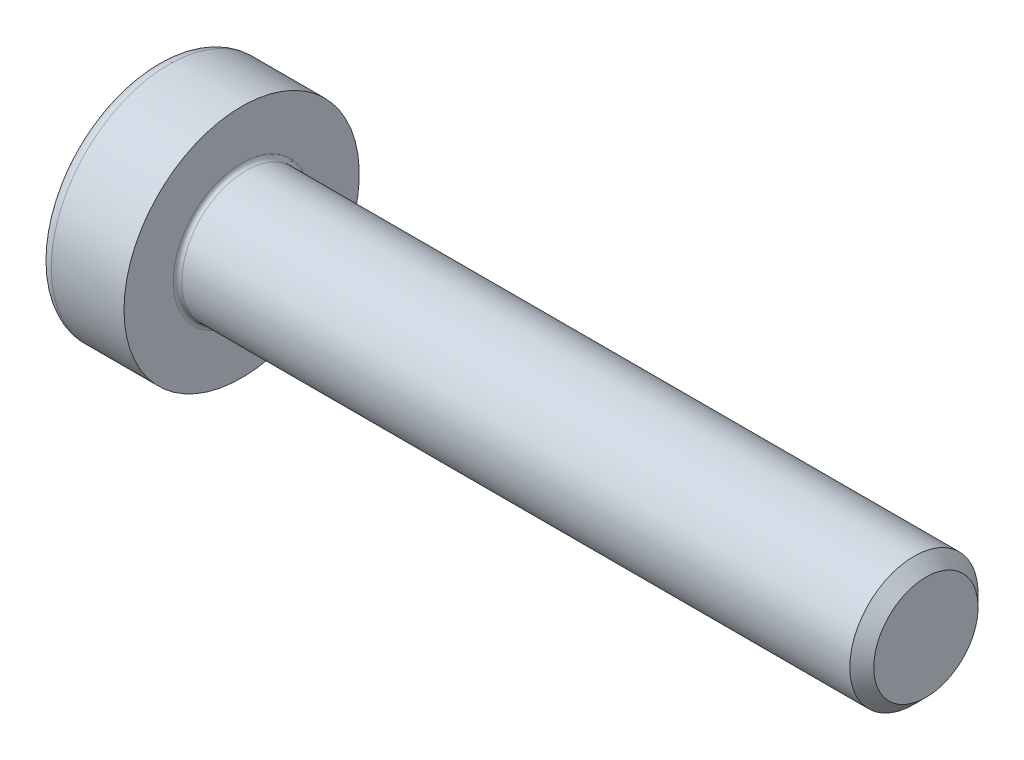
ISO-10303-21;
HEADER;
FILE_DESCRIPTION(('STEP AP214'),'2;1');
FILE_NAME('part.step','',(''),(''),'','','');
FILE_SCHEMA(('AUTOMOTIVE_DESIGN { 1 0 10303 214 1 1 1 1 }'));
ENDSEC;
DATA;
#1=APPLICATION_CONTEXT('core data for automotive mechanical design processes');
#2=APPLICATION_PROTOCOL_DEFINITION('international standard','automotive_design',2000,#1);
#3=PRODUCT_CONTEXT('',#1,'mechanical');
#4=PRODUCT('Part','Part','',(#3));
#5=PRODUCT_RELATED_PRODUCT_CATEGORY('part','',(#4));
#6=PRODUCT_DEFINITION_FORMATION('','',#4);
#7=PRODUCT_DEFINITION_CONTEXT('part definition',#1,'design');
#8=PRODUCT_DEFINITION('design','',#6,#7);
#9=PRODUCT_DEFINITION_SHAPE('','',#8);
#10=(LENGTH_UNIT() NAMED_UNIT(*) SI_UNIT(.MILLI.,.METRE.));
#11=(NAMED_UNIT(*) PLANE_ANGLE_UNIT() SI_UNIT($,.RADIAN.));
#12=(NAMED_UNIT(*) SI_UNIT($,.STERADIAN.) SOLID_ANGLE_UNIT());
#13=UNCERTAINTY_MEASURE_WITH_UNIT(LENGTH_MEASURE(1.E-05),#10,'distance_accuracy_value','');
#14=(GEOMETRIC_REPRESENTATION_CONTEXT(3) GLOBAL_UNCERTAINTY_ASSIGNED_CONTEXT((#13)) GLOBAL_UNIT_ASSIGNED_CONTEXT((#10,
#11,#12)) REPRESENTATION_CONTEXT('',''));
#15=CARTESIAN_POINT('',(0.,0.,0.));
#16=DIRECTION('',(0.,0.,1.));
#17=DIRECTION('',(1.,0.,0.));
#18=AXIS2_PLACEMENT_3D('',#15,#16,#17);
#19=CARTESIAN_POINT('',(0.,0.,0.));
#20=DIRECTION('',(-1.,0.,0.));
#21=DIRECTION('',(0.,0.,1.));
#22=AXIS2_PLACEMENT_3D('',#19,#20,#21);
#23=PLANE('',#22);
#24=DIRECTION('',(0.,-0.499999999999997,0.86602540378444));
#25=VECTOR('',#24,1.);
#26=CARTESIAN_POINT('',(0.,1.15470053837926,0.));
#27=LINE('',#26,#25);
#28=CARTESIAN_POINT('',(0.,1.15470053837926,0.));
#29=VERTEX_POINT('',#28);
#30=CARTESIAN_POINT('',(0.,0.577350269189635,0.999999999999995));
#31=VERTEX_POINT('',#30);
#32=EDGE_CURVE('E261',#29,#31,#27,.T.);
#33=ORIENTED_EDGE('',*,*,#32,.T.);
#34=DIRECTION('',(0.,1.,0.));
#35=VECTOR('',#34,1.);
#36=CARTESIAN_POINT('',(0.,-0.577350269189617,0.999999999999997));
#37=LINE('',#36,#35);
#38=CARTESIAN_POINT('',(0.,-0.577350269189617,0.999999999999997));
#39=VERTEX_POINT('',#38);
#40=EDGE_CURVE('E122',#39,#31,#37,.T.);
#41=ORIENTED_EDGE('',*,*,#40,.F.);
#42=DIRECTION('',(0.,-0.500000000000001,-0.866025403784438));
#43=VECTOR('',#42,1.);
#44=CARTESIAN_POINT('',(0.,-0.577350269189617,0.999999999999997));
#45=LINE('',#44,#43);
#46=CARTESIAN_POINT('',(0.,-1.15470053837924,0.));
#47=VERTEX_POINT('',#46);
#48=EDGE_CURVE('E264',#39,#47,#45,.T.);
#49=ORIENTED_EDGE('',*,*,#48,.T.);
#50=DIRECTION('',(0.,0.499999999999998,-0.86602540378444));
#51=VECTOR('',#50,1.);
#52=CARTESIAN_POINT('',(0.,-1.15470053837924,0.));
#53=LINE('',#52,#51);
#54=CARTESIAN_POINT('',(0.,-0.577350269189621,-1.));
#55=VERTEX_POINT('',#54);
#56=EDGE_CURVE('E267',#47,#55,#53,.T.);
#57=ORIENTED_EDGE('',*,*,#56,.T.);
#58=DIRECTION('',(0.,-1.,0.));
#59=VECTOR('',#58,1.);
#60=CARTESIAN_POINT('',(0.,0.57735026918963,-1.00000000000001));
#61=LINE('',#60,#59);
#62=CARTESIAN_POINT('',(0.,0.57735026918963,-1.00000000000001));
#63=VERTEX_POINT('',#62);
#64=EDGE_CURVE('E270',#63,#55,#61,.T.);
#65=ORIENTED_EDGE('',*,*,#64,.F.);
#66=DIRECTION('',(0.,-0.500000000000001,-0.866025403784438));
#67=VECTOR('',#66,1.);
#68=CARTESIAN_POINT('',(0.,1.15470053837926,0.));
#69=LINE('',#68,#67);
#70=EDGE_CURVE('E117',#29,#63,#69,.T.);
#71=ORIENTED_EDGE('',*,*,#70,.F.);
#72=EDGE_LOOP('',(#33,#41,#49,#57,#65,#71));
#73=FACE_BOUND('',#72,.T.);
#74=CARTESIAN_POINT('',(0.,0.,0.));
#75=DIRECTION('',(-1.,0.,0.));
#76=DIRECTION('',(0.,0.,1.));
#77=AXIS2_PLACEMENT_3D('',#74,#75,#76);
#78=CIRCLE('',#77,2.45);
#79=CARTESIAN_POINT('',(0.,0.,2.45));
#80=VERTEX_POINT('',#79);
#81=EDGE_CURVE('E38',#80,#80,#78,.T.);
#82=ORIENTED_EDGE('',*,*,#81,.T.);
#83=EDGE_LOOP('',(#82));
#84=FACE_BOUND('',#83,.T.);
#85=ADVANCED_FACE('F30',(#73,#84),#23,.T.);
#86=CARTESIAN_POINT('',(-31.75,0.,0.));
#87=DIRECTION('',(-1.,0.,0.));
#88=DIRECTION('',(0.,0.,1.));
#89=AXIS2_PLACEMENT_3D('',#86,#87,#88);
#90=CYLINDRICAL_SURFACE('',#89,2.75);
#91=CARTESIAN_POINT('',(0.300000000000002,0.,0.));
#92=DIRECTION('',(-1.,0.,0.));
#93=DIRECTION('',(0.,0.,1.));
#94=AXIS2_PLACEMENT_3D('',#91,#92,#93);
#95=CIRCLE('',#94,2.75);
#96=CARTESIAN_POINT('',(0.300000000000002,0.,2.75));
#97=VERTEX_POINT('',#96);
#98=EDGE_CURVE('E11',#97,#97,#95,.F.);
#99=ORIENTED_EDGE('',*,*,#98,.T.);
#100=EDGE_LOOP('',(#99));
#101=FACE_BOUND('',#100,.T.);
#102=CARTESIAN_POINT('',(2.,0.,0.));
#103=DIRECTION('',(-1.,0.,0.));
#104=DIRECTION('',(0.,0.,1.));
#105=AXIS2_PLACEMENT_3D('',#102,#103,#104);
#106=CIRCLE('',#105,2.75);
#107=CARTESIAN_POINT('',(2.,0.,2.75));
#108=VERTEX_POINT('',#107);
#109=EDGE_CURVE('E140',#108,#108,#106,.T.);
#110=ORIENTED_EDGE('',*,*,#109,.T.);
#111=EDGE_LOOP('',(#110));
#112=FACE_BOUND('',#111,.T.);
#113=ADVANCED_FACE('F164',(#101,#112),#90,.T.);
#114=CARTESIAN_POINT('',(2.,2.75,0.));
#115=DIRECTION('',(1.,0.,0.));
#116=DIRECTION('',(0.,0.,-1.));
#117=AXIS2_PLACEMENT_3D('',#114,#115,#116);
#118=PLANE('',#117);
#119=CARTESIAN_POINT('',(2.,0.,0.));
#120=DIRECTION('',(1.,0.,0.));
#121=DIRECTION('',(0.,0.,-1.));
#122=AXIS2_PLACEMENT_3D('',#119,#120,#121);
#123=CIRCLE('',#122,1.59999999999999);
#124=CARTESIAN_POINT('',(2.,0.,-1.59999999999999));
#125=VERTEX_POINT('',#124);
#126=EDGE_CURVE('E143',#125,#125,#123,.F.);
#127=ORIENTED_EDGE('',*,*,#126,.T.);
#128=EDGE_LOOP('',(#127));
#129=FACE_BOUND('',#128,.T.);
#130=ORIENTED_EDGE('',*,*,#109,.F.);
#131=EDGE_LOOP('',(#130));
#132=FACE_BOUND('',#131,.T.);
#133=ADVANCED_FACE('F170',(#129,#132),#118,.T.);
#134=CARTESIAN_POINT('',(-31.75,0.,0.));
#135=DIRECTION('',(-1.,0.,0.));
#136=DIRECTION('',(0.,0.,1.));
#137=AXIS2_PLACEMENT_3D('',#134,#135,#136);
#138=CYLINDRICAL_SURFACE('',#137,1.49999999999999);
#139=CARTESIAN_POINT('',(2.1,0.,0.));
#140=DIRECTION('',(1.,0.,0.));
#141=DIRECTION('',(0.,0.,-1.));
#142=AXIS2_PLACEMENT_3D('',#139,#140,#141);
#143=CIRCLE('',#142,1.49999999999999);
#144=CARTESIAN_POINT('',(2.1,0.,-1.49999999999999));
#145=VERTEX_POINT('',#144);
#146=EDGE_CURVE('E146',#145,#145,#143,.T.);
#147=ORIENTED_EDGE('',*,*,#146,.T.);
#148=EDGE_LOOP('',(#147));
#149=FACE_BOUND('',#148,.T.);
#150=CARTESIAN_POINT('',(17.7195,0.,0.));
#151=DIRECTION('',(-1.,0.,0.));
#152=DIRECTION('',(0.,0.,1.));
#153=AXIS2_PLACEMENT_3D('',#150,#151,#152);
#154=CIRCLE('',#153,1.49999999999999);
#155=CARTESIAN_POINT('',(17.7195,0.,1.49999999999999));
#156=VERTEX_POINT('',#155);
#157=EDGE_CURVE('E137',#156,#156,#154,.T.);
#158=ORIENTED_EDGE('',*,*,#157,.T.);
#159=EDGE_LOOP('',(#158));
#160=FACE_BOUND('',#159,.T.);
#161=ADVANCED_FACE('F176',(#149,#160),#138,.T.);
#162=CARTESIAN_POINT('',(18.,0.,0.));
#163=DIRECTION('',(-1.,0.,0.));
#164=DIRECTION('',(0.,0.,1.));
#165=AXIS2_PLACEMENT_3D('',#162,#163,#164);
#166=CONICAL_SURFACE('',#165,1.2195,0.785398163397407);
#167=ORIENTED_EDGE('',*,*,#157,.F.);
#168=EDGE_LOOP('',(#167));
#169=FACE_BOUND('',#168,.T.);
#170=CARTESIAN_POINT('',(18.,0.,0.));
#171=DIRECTION('',(-1.,0.,0.));
#172=DIRECTION('',(0.,0.,1.));
#173=AXIS2_PLACEMENT_3D('',#170,#171,#172);
#174=CIRCLE('',#173,1.2195);
#175=CARTESIAN_POINT('',(18.,0.,1.2195));
#176=VERTEX_POINT('',#175);
#177=EDGE_CURVE('E133',#176,#176,#174,.T.);
#178=ORIENTED_EDGE('',*,*,#177,.T.);
#179=EDGE_LOOP('',(#178));
#180=FACE_BOUND('',#179,.T.);
#181=ADVANCED_FACE('F180',(#169,#180),#166,.T.);
#182=CARTESIAN_POINT('',(18.,1.2195,0.));
#183=DIRECTION('',(1.,0.,0.));
#184=DIRECTION('',(0.,0.,-1.));
#185=AXIS2_PLACEMENT_3D('',#182,#183,#184);
#186=PLANE('',#185);
#187=ORIENTED_EDGE('',*,*,#177,.F.);
#188=EDGE_LOOP('',(#187));
#189=FACE_BOUND('',#188,.T.);
#190=ADVANCED_FACE('F160',(#189),#186,.T.);
#191=CARTESIAN_POINT('',(2.1,0.,0.));
#192=DIRECTION('',(1.,0.,0.));
#193=DIRECTION('',(0.,0.,-1.));
#194=AXIS2_PLACEMENT_3D('',#191,#192,#193);
#195=TOROIDAL_SURFACE('',#194,1.59999999999999,0.1);
#196=ORIENTED_EDGE('',*,*,#146,.F.);
#197=EDGE_LOOP('',(#196));
#198=FACE_BOUND('',#197,.T.);
#199=ORIENTED_EDGE('',*,*,#126,.F.);
#200=EDGE_LOOP('',(#199));
#201=FACE_BOUND('',#200,.T.);
#202=ADVANCED_FACE('F153',(#198,#201),#195,.F.);
#203=CARTESIAN_POINT('',(0.300000000000002,0.,0.));
#204=DIRECTION('',(-1.,0.,0.));
#205=DIRECTION('',(0.,0.,1.));
#206=AXIS2_PLACEMENT_3D('',#203,#204,#205);
#207=TOROIDAL_SURFACE('',#206,2.45,0.3);
#208=ORIENTED_EDGE('',*,*,#98,.F.);
#209=EDGE_LOOP('',(#208));
#210=FACE_BOUND('',#209,.T.);
#211=ORIENTED_EDGE('',*,*,#81,.F.);
#212=EDGE_LOOP('',(#211));
#213=FACE_BOUND('',#212,.T.);
#214=ADVANCED_FACE('F32',(#210,#213),#207,.T.);
#215=CARTESIAN_POINT('',(1.5,1.15470053837926,0.));
#216=DIRECTION('',(0.,-0.86602540378444,-0.499999999999997));
#217=DIRECTION('',(0.,0.499999999999998,-0.86602540378444));
#218=AXIS2_PLACEMENT_3D('',#215,#216,#217);
#219=PLANE('',#218);
#220=ORIENTED_EDGE('',*,*,#32,.F.);
#221=DIRECTION('',(-1.,0.,0.));
#222=VECTOR('',#221,1.);
#223=CARTESIAN_POINT('',(1.5,1.15470053837926,0.));
#224=LINE('',#223,#222);
#225=CARTESIAN_POINT('',(1.5,1.15470053837926,0.));
#226=VERTEX_POINT('',#225);
#227=EDGE_CURVE('E260',#226,#29,#224,.T.);
#228=ORIENTED_EDGE('',*,*,#227,.F.);
#229=DIRECTION('',(0.,-0.499999999999997,0.86602540378444));
#230=VECTOR('',#229,1.);
#231=CARTESIAN_POINT('',(1.5,1.15470053837926,0.));
#232=LINE('',#231,#230);
#233=CARTESIAN_POINT('',(1.5,0.86602540378444,0.499999999999997));
#234=VERTEX_POINT('',#233);
#235=EDGE_CURVE('E45',#226,#234,#232,.T.);
#236=ORIENTED_EDGE('',*,*,#235,.T.);
#237=CARTESIAN_POINT('',(1.5,0.577350269189635,0.999999999999995));
#238=VERTEX_POINT('',#237);
#239=EDGE_CURVE('E103',#234,#238,#232,.T.);
#240=ORIENTED_EDGE('',*,*,#239,.T.);
#241=DIRECTION('',(-1.,0.,0.));
#242=VECTOR('',#241,1.);
#243=CARTESIAN_POINT('',(1.5,0.577350269189635,0.999999999999995));
#244=LINE('',#243,#242);
#245=EDGE_CURVE('E115',#238,#31,#244,.T.);
#246=ORIENTED_EDGE('',*,*,#245,.T.);
#247=EDGE_LOOP('',(#220,#228,#236,#240,#246));
#248=FACE_BOUND('',#247,.T.);
#249=ADVANCED_FACE('F114',(#248),#219,.T.);
#250=CARTESIAN_POINT('',(1.5,-0.577350269189617,0.999999999999997));
#251=DIRECTION('',(0.,0.,1.));
#252=DIRECTION('',(0.,-1.,0.));
#253=AXIS2_PLACEMENT_3D('',#250,#251,#252);
#254=PLANE('',#253);
#255=ORIENTED_EDGE('',*,*,#40,.T.);
#256=ORIENTED_EDGE('',*,*,#245,.F.);
#257=DIRECTION('',(0.,1.,0.));
#258=VECTOR('',#257,1.);
#259=CARTESIAN_POINT('',(1.5,-0.577350269189617,0.999999999999997));
#260=LINE('',#259,#258);
#261=CARTESIAN_POINT('',(1.5,0.,0.999999999999996));
#262=VERTEX_POINT('',#261);
#263=EDGE_CURVE('E101',#262,#238,#260,.T.);
#264=ORIENTED_EDGE('',*,*,#263,.F.);
#265=CARTESIAN_POINT('',(1.5,-0.577350269189617,0.999999999999997));
#266=VERTEX_POINT('',#265);
#267=EDGE_CURVE('E111',#266,#262,#260,.T.);
#268=ORIENTED_EDGE('',*,*,#267,.F.);
#269=DIRECTION('',(-1.,0.,0.));
#270=VECTOR('',#269,1.);
#271=CARTESIAN_POINT('',(1.5,-0.577350269189617,0.999999999999997));
#272=LINE('',#271,#270);
#273=EDGE_CURVE('E124',#266,#39,#272,.T.);
#274=ORIENTED_EDGE('',*,*,#273,.T.);
#275=EDGE_LOOP('',(#255,#256,#264,#268,#274));
#276=FACE_BOUND('',#275,.T.);
#277=ADVANCED_FACE('F119',(#276),#254,.F.);
#278=CARTESIAN_POINT('',(1.5,-0.577350269189617,0.999999999999997));
#279=DIRECTION('',(0.,0.866025403784438,-0.500000000000001));
#280=DIRECTION('',(0.,0.500000000000001,0.866025403784438));
#281=AXIS2_PLACEMENT_3D('',#278,#279,#280);
#282=PLANE('',#281);
#283=ORIENTED_EDGE('',*,*,#48,.F.);
#284=ORIENTED_EDGE('',*,*,#273,.F.);
#285=DIRECTION('',(0.,-0.500000000000001,-0.866025403784438));
#286=VECTOR('',#285,1.);
#287=CARTESIAN_POINT('',(1.5,-0.577350269189617,0.999999999999997));
#288=LINE('',#287,#286);
#289=CARTESIAN_POINT('',(1.5,-0.86602540378443,0.499999999999996));
#290=VERTEX_POINT('',#289);
#291=EDGE_CURVE('E241',#266,#290,#288,.T.);
#292=ORIENTED_EDGE('',*,*,#291,.T.);
#293=CARTESIAN_POINT('',(1.5,-1.15470053837924,0.));
#294=VERTEX_POINT('',#293);
#295=EDGE_CURVE('E243',#290,#294,#288,.T.);
#296=ORIENTED_EDGE('',*,*,#295,.T.);
#297=DIRECTION('',(-1.,0.,0.));
#298=VECTOR('',#297,1.);
#299=CARTESIAN_POINT('',(1.5,-1.15470053837924,0.));
#300=LINE('',#299,#298);
#301=EDGE_CURVE('E129',#294,#47,#300,.T.);
#302=ORIENTED_EDGE('',*,*,#301,.T.);
#303=EDGE_LOOP('',(#283,#284,#292,#296,#302));
#304=FACE_BOUND('',#303,.T.);
#305=ADVANCED_FACE('F193',(#304),#282,.T.);
#306=CARTESIAN_POINT('',(1.5,-1.15470053837924,0.));
#307=DIRECTION('',(0.,0.86602540378444,0.499999999999998));
#308=DIRECTION('',(0.,-0.499999999999998,0.86602540378444));
#309=AXIS2_PLACEMENT_3D('',#306,#307,#308);
#310=PLANE('',#309);
#311=ORIENTED_EDGE('',*,*,#56,.F.);
#312=ORIENTED_EDGE('',*,*,#301,.F.);
#313=DIRECTION('',(0.,0.499999999999998,-0.86602540378444));
#314=VECTOR('',#313,1.);
#315=CARTESIAN_POINT('',(1.5,-1.15470053837924,0.));
#316=LINE('',#315,#314);
#317=CARTESIAN_POINT('',(1.5,-0.866025403784436,-0.499999999999996));
#318=VERTEX_POINT('',#317);
#319=EDGE_CURVE('E246',#294,#318,#316,.T.);
#320=ORIENTED_EDGE('',*,*,#319,.T.);
#321=CARTESIAN_POINT('',(1.5,-0.577350269189621,-1.));
#322=VERTEX_POINT('',#321);
#323=EDGE_CURVE('E250',#318,#322,#316,.T.);
#324=ORIENTED_EDGE('',*,*,#323,.T.);
#325=DIRECTION('',(-1.,0.,0.));
#326=VECTOR('',#325,1.);
#327=CARTESIAN_POINT('',(1.5,-0.577350269189621,-1.));
#328=LINE('',#327,#326);
#329=EDGE_CURVE('E279',#322,#55,#328,.T.);
#330=ORIENTED_EDGE('',*,*,#329,.T.);
#331=EDGE_LOOP('',(#311,#312,#320,#324,#330));
#332=FACE_BOUND('',#331,.T.);
#333=ADVANCED_FACE('F196',(#332),#310,.T.);
#334=CARTESIAN_POINT('',(1.5,0.57735026918963,-1.00000000000001));
#335=DIRECTION('',(0.,0.,-1.));
#336=DIRECTION('',(0.,1.,0.));
#337=AXIS2_PLACEMENT_3D('',#334,#335,#336);
#338=PLANE('',#337);
#339=ORIENTED_EDGE('',*,*,#64,.T.);
#340=ORIENTED_EDGE('',*,*,#329,.F.);
#341=DIRECTION('',(0.,-1.,0.));
#342=VECTOR('',#341,1.);
#343=CARTESIAN_POINT('',(1.5,0.57735026918963,-1.00000000000001));
#344=LINE('',#343,#342);
#345=CARTESIAN_POINT('',(1.5,0.,-1.));
#346=VERTEX_POINT('',#345);
#347=EDGE_CURVE('E254',#346,#322,#344,.T.);
#348=ORIENTED_EDGE('',*,*,#347,.F.);
#349=CARTESIAN_POINT('',(1.5,0.57735026918963,-1.00000000000001));
#350=VERTEX_POINT('',#349);
#351=EDGE_CURVE('E255',#350,#346,#344,.T.);
#352=ORIENTED_EDGE('',*,*,#351,.F.);
#353=DIRECTION('',(-1.,0.,0.));
#354=VECTOR('',#353,1.);
#355=CARTESIAN_POINT('',(1.5,0.57735026918963,-1.00000000000001));
#356=LINE('',#355,#354);
#357=EDGE_CURVE('E276',#350,#63,#356,.T.);
#358=ORIENTED_EDGE('',*,*,#357,.T.);
#359=EDGE_LOOP('',(#339,#340,#348,#352,#358));
#360=FACE_BOUND('',#359,.T.);
#361=ADVANCED_FACE('F200',(#360),#338,.F.);
#362=CARTESIAN_POINT('',(1.5,1.15470053837926,0.));
#363=DIRECTION('',(0.,0.866025403784438,-0.500000000000001));
#364=DIRECTION('',(0.,0.500000000000001,0.866025403784438));
#365=AXIS2_PLACEMENT_3D('',#362,#363,#364);
#366=PLANE('',#365);
#367=ORIENTED_EDGE('',*,*,#70,.T.);
#368=ORIENTED_EDGE('',*,*,#357,.F.);
#369=DIRECTION('',(0.,-0.500000000000001,-0.866025403784438));
#370=VECTOR('',#369,1.);
#371=CARTESIAN_POINT('',(1.5,1.15470053837926,0.));
#372=LINE('',#371,#370);
#373=CARTESIAN_POINT('',(1.5,0.866025403784444,-0.500000000000005));
#374=VERTEX_POINT('',#373);
#375=EDGE_CURVE('E258',#374,#350,#372,.T.);
#376=ORIENTED_EDGE('',*,*,#375,.F.);
#377=EDGE_CURVE('E232',#226,#374,#372,.T.);
#378=ORIENTED_EDGE('',*,*,#377,.F.);
#379=ORIENTED_EDGE('',*,*,#227,.T.);
#380=EDGE_LOOP('',(#367,#368,#376,#378,#379));
#381=FACE_BOUND('',#380,.T.);
#382=ADVANCED_FACE('F204',(#381),#366,.F.);
#383=CARTESIAN_POINT('',(1.5,0.577350269189635,0.999999999999995));
#384=DIRECTION('',(-1.,0.,0.));
#385=DIRECTION('',(0.,0.,1.));
#386=AXIS2_PLACEMENT_3D('',#383,#384,#385);
#387=PLANE('',#386);
#388=CARTESIAN_POINT('',(1.5,0.,0.));
#389=DIRECTION('',(-1.,0.,0.));
#390=DIRECTION('',(0.,0.,1.));
#391=AXIS2_PLACEMENT_3D('',#388,#389,#390);
#392=CIRCLE('',#391,1.);
#393=EDGE_CURVE('E123',#290,#262,#392,.T.);
#394=ORIENTED_EDGE('',*,*,#393,.F.);
#395=ORIENTED_EDGE('',*,*,#291,.F.);
#396=ORIENTED_EDGE('',*,*,#267,.T.);
#397=EDGE_LOOP('',(#394,#395,#396));
#398=FACE_BOUND('',#397,.T.);
#399=ADVANCED_FACE('F208',(#398),#387,.T.);
#400=EDGE_CURVE('E127',#318,#290,#392,.T.);
#401=ORIENTED_EDGE('',*,*,#400,.F.);
#402=ORIENTED_EDGE('',*,*,#319,.F.);
#403=ORIENTED_EDGE('',*,*,#295,.F.);
#404=EDGE_LOOP('',(#401,#402,#403));
#405=FACE_BOUND('',#404,.T.);
#406=ADVANCED_FACE('F211',(#405),#387,.T.);
#407=EDGE_CURVE('E285',#346,#318,#392,.T.);
#408=ORIENTED_EDGE('',*,*,#407,.F.);
#409=ORIENTED_EDGE('',*,*,#347,.T.);
#410=ORIENTED_EDGE('',*,*,#323,.F.);
#411=EDGE_LOOP('',(#408,#409,#410));
#412=FACE_BOUND('',#411,.T.);
#413=ADVANCED_FACE('F216',(#412),#387,.T.);
#414=EDGE_CURVE('E235',#374,#346,#392,.T.);
#415=ORIENTED_EDGE('',*,*,#414,.F.);
#416=ORIENTED_EDGE('',*,*,#375,.T.);
#417=ORIENTED_EDGE('',*,*,#351,.T.);
#418=EDGE_LOOP('',(#415,#416,#417));
#419=FACE_BOUND('',#418,.T.);
#420=ADVANCED_FACE('F223',(#419),#387,.T.);
#421=EDGE_CURVE('E134',#234,#374,#392,.T.);
#422=ORIENTED_EDGE('',*,*,#421,.F.);
#423=ORIENTED_EDGE('',*,*,#235,.F.);
#424=ORIENTED_EDGE('',*,*,#377,.T.);
#425=EDGE_LOOP('',(#422,#423,#424));
#426=FACE_BOUND('',#425,.T.);
#427=ADVANCED_FACE('F219',(#426),#387,.T.);
#428=EDGE_CURVE('E106',#262,#234,#392,.T.);
#429=ORIENTED_EDGE('',*,*,#428,.F.);
#430=ORIENTED_EDGE('',*,*,#263,.T.);
#431=ORIENTED_EDGE('',*,*,#239,.F.);
#432=EDGE_LOOP('',(#429,#430,#431));
#433=FACE_BOUND('',#432,.T.);
#434=ADVANCED_FACE('F102',(#433),#387,.T.);
#435=CARTESIAN_POINT('',(1.5,0.,0.));
#436=DIRECTION('',(-1.,0.,0.));
#437=DIRECTION('',(0.,0.,1.));
#438=AXIS2_PLACEMENT_3D('',#435,#436,#437);
#439=CONICAL_SURFACE('',#438,1.,1.04719755119659);
#440=CARTESIAN_POINT('',(2.07735026918963,0.,0.));
#441=VERTEX_POINT('',#440);
#442=VERTEX_LOOP('',#441);
#443=FACE_BOUND('',#442,.T.);
#444=ORIENTED_EDGE('',*,*,#428,.T.);
#445=ORIENTED_EDGE('',*,*,#421,.T.);
#446=ORIENTED_EDGE('',*,*,#414,.T.);
#447=ORIENTED_EDGE('',*,*,#407,.T.);
#448=ORIENTED_EDGE('',*,*,#400,.T.);
#449=ORIENTED_EDGE('',*,*,#393,.T.);
#450=EDGE_LOOP('',(#444,#445,#446,#447,#448,#449));
#451=FACE_BOUND('',#450,.T.);
#452=ADVANCED_FACE('F188',(#443,#451),#439,.F.);
#453=CLOSED_SHELL('',(#85,#113,#133,#161,#181,#190,#202,#214,#249,#277,#305,#333,#361,#382,#399,
#406,#413,#420,#427,#434,#452));
#454=MANIFOLD_SOLID_BREP('B2',#453);
#455=ADVANCED_BREP_SHAPE_REPRESENTATION('',(#18,#454),#14);
#456=SHAPE_DEFINITION_REPRESENTATION(#9,#455);
ENDSEC;
END-ISO-10303-21;
